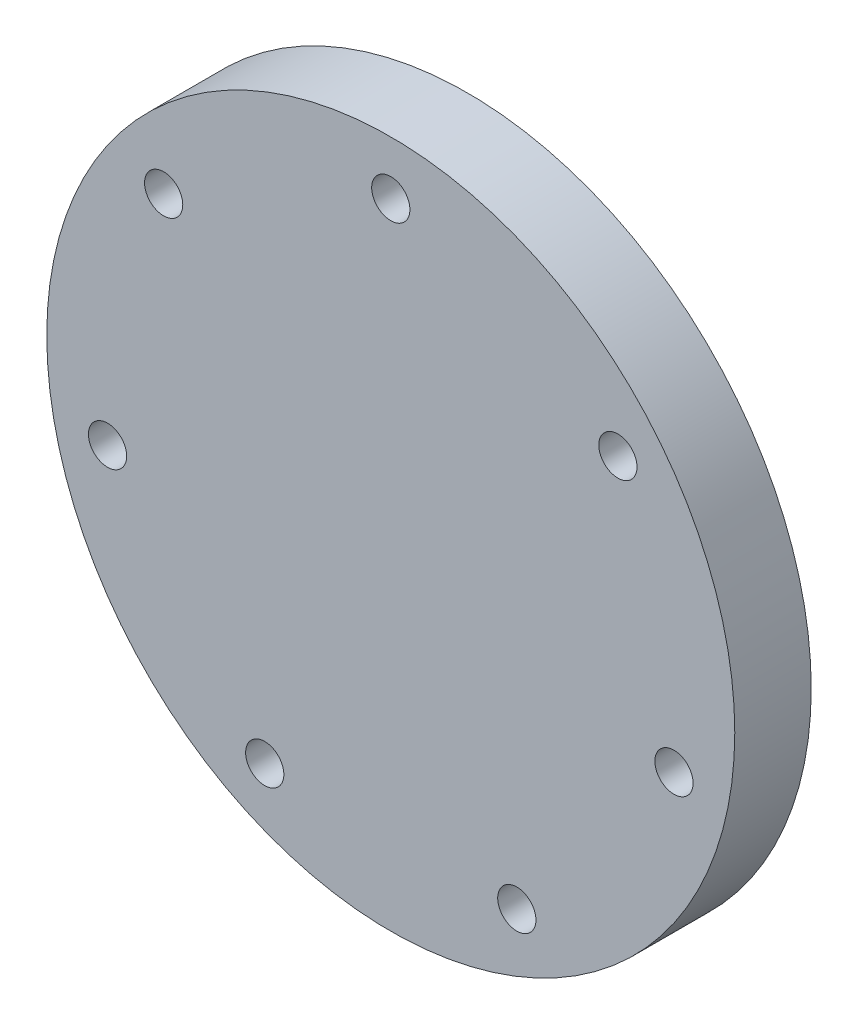
ISO-10303-21;
HEADER;
FILE_DESCRIPTION(('STEP AP214'),'2;1');
FILE_NAME('part.step','',(''),(''),'','','');
FILE_SCHEMA(('AUTOMOTIVE_DESIGN { 1 0 10303 214 1 1 1 1 }'));
ENDSEC;
DATA;
#1=APPLICATION_CONTEXT('core data for automotive mechanical design processes');
#2=APPLICATION_PROTOCOL_DEFINITION('international standard','automotive_design',2000,#1);
#3=PRODUCT_CONTEXT('',#1,'mechanical');
#4=PRODUCT('Part','Part','',(#3));
#5=PRODUCT_RELATED_PRODUCT_CATEGORY('part','',(#4));
#6=PRODUCT_DEFINITION_FORMATION('','',#4);
#7=PRODUCT_DEFINITION_CONTEXT('part definition',#1,'design');
#8=PRODUCT_DEFINITION('design','',#6,#7);
#9=PRODUCT_DEFINITION_SHAPE('','',#8);
#10=(LENGTH_UNIT() NAMED_UNIT(*) SI_UNIT(.MILLI.,.METRE.));
#11=(NAMED_UNIT(*) PLANE_ANGLE_UNIT() SI_UNIT($,.RADIAN.));
#12=(NAMED_UNIT(*) SI_UNIT($,.STERADIAN.) SOLID_ANGLE_UNIT());
#13=UNCERTAINTY_MEASURE_WITH_UNIT(LENGTH_MEASURE(1.E-05),#10,'distance_accuracy_value','');
#14=(GEOMETRIC_REPRESENTATION_CONTEXT(3) GLOBAL_UNCERTAINTY_ASSIGNED_CONTEXT((#13)) GLOBAL_UNIT_ASSIGNED_CONTEXT((#10,
#11,#12)) REPRESENTATION_CONTEXT('',''));
#15=CARTESIAN_POINT('',(0.,0.,0.));
#16=DIRECTION('',(0.,0.,1.));
#17=DIRECTION('',(1.,0.,0.));
#18=AXIS2_PLACEMENT_3D('',#15,#16,#17);
#19=CARTESIAN_POINT('',(0.,0.,5.));
#20=DIRECTION('',(0.,0.,1.));
#21=DIRECTION('',(1.,0.,0.));
#22=AXIS2_PLACEMENT_3D('',#19,#20,#21);
#23=PLANE('',#22);
#24=CARTESIAN_POINT('',(-8.24379104323223,-17.1184084901463,5.));
#25=DIRECTION('',(0.,0.,1.));
#26=DIRECTION('',(1.,0.,0.));
#27=AXIS2_PLACEMENT_3D('',#24,#25,#26);
#28=CIRCLE('',#27,1.25000000000021);
#29=CARTESIAN_POINT('',(-6.99379104323203,-17.1184084901463,5.));
#30=VERTEX_POINT('',#29);
#31=EDGE_CURVE('E71',#30,#30,#28,.T.);
#32=ORIENTED_EDGE('',*,*,#31,.F.);
#33=EDGE_LOOP('',(#32));
#34=FACE_BOUND('',#33,.T.);
#35=CARTESIAN_POINT('',(18.5236303314554,-4.22789774516939,5.));
#36=DIRECTION('',(0.,0.,1.));
#37=DIRECTION('',(1.,0.,0.));
#38=AXIS2_PLACEMENT_3D('',#35,#36,#37);
#39=CIRCLE('',#38,1.25);
#40=CARTESIAN_POINT('',(19.7736303314554,-4.22789774516939,5.));
#41=VERTEX_POINT('',#40);
#42=EDGE_CURVE('E59',#41,#41,#39,.T.);
#43=ORIENTED_EDGE('',*,*,#42,.F.);
#44=EDGE_LOOP('',(#43));
#45=FACE_BOUND('',#44,.T.);
#46=CARTESIAN_POINT('',(-14.8547981668923,11.8463062353154,5.));
#47=DIRECTION('',(0.,0.,1.));
#48=DIRECTION('',(1.,0.,0.));
#49=AXIS2_PLACEMENT_3D('',#46,#47,#48);
#50=CIRCLE('',#49,1.25000000000064);
#51=CARTESIAN_POINT('',(-13.6047981668917,11.8463062353154,5.));
#52=VERTEX_POINT('',#51);
#53=EDGE_CURVE('E47',#52,#52,#50,.T.);
#54=ORIENTED_EDGE('',*,*,#53,.F.);
#55=EDGE_LOOP('',(#54));
#56=FACE_BOUND('',#55,.T.);
#57=CARTESIAN_POINT('',(0.,0.,5.));
#58=DIRECTION('',(0.,0.,1.));
#59=DIRECTION('',(1.,0.,0.));
#60=AXIS2_PLACEMENT_3D('',#57,#58,#59);
#61=CIRCLE('',#60,22.5);
#62=CARTESIAN_POINT('',(22.5,0.,5.));
#63=VERTEX_POINT('',#62);
#64=EDGE_CURVE('E10',#63,#63,#61,.T.);
#65=ORIENTED_EDGE('',*,*,#64,.T.);
#66=EDGE_LOOP('',(#65));
#67=FACE_BOUND('',#66,.T.);
#68=CARTESIAN_POINT('',(0.,19.,5.));
#69=DIRECTION('',(0.,0.,1.));
#70=DIRECTION('',(1.,0.,0.));
#71=AXIS2_PLACEMENT_3D('',#68,#69,#70);
#72=CIRCLE('',#71,1.25);
#73=CARTESIAN_POINT('',(1.25,19.,5.));
#74=VERTEX_POINT('',#73);
#75=EDGE_CURVE('E42',#74,#74,#72,.T.);
#76=ORIENTED_EDGE('',*,*,#75,.F.);
#77=EDGE_LOOP('',(#76));
#78=FACE_BOUND('',#77,.T.);
#79=CARTESIAN_POINT('',(14.854798166893,11.8463062353164,5.));
#80=DIRECTION('',(0.,0.,1.));
#81=DIRECTION('',(1.,0.,0.));
#82=AXIS2_PLACEMENT_3D('',#79,#80,#81);
#83=CIRCLE('',#82,1.25);
#84=CARTESIAN_POINT('',(16.104798166893,11.8463062353164,5.));
#85=VERTEX_POINT('',#84);
#86=EDGE_CURVE('E53',#85,#85,#83,.T.);
#87=ORIENTED_EDGE('',*,*,#86,.F.);
#88=EDGE_LOOP('',(#87));
#89=FACE_BOUND('',#88,.T.);
#90=CARTESIAN_POINT('',(8.24379104323457,-17.1184084901455,5.));
#91=DIRECTION('',(0.,0.,1.));
#92=DIRECTION('',(1.,0.,0.));
#93=AXIS2_PLACEMENT_3D('',#90,#91,#92);
#94=CIRCLE('',#93,1.25);
#95=CARTESIAN_POINT('',(9.49379104323457,-17.1184084901455,5.));
#96=VERTEX_POINT('',#95);
#97=EDGE_CURVE('E65',#96,#96,#94,.T.);
#98=ORIENTED_EDGE('',*,*,#97,.F.);
#99=EDGE_LOOP('',(#98));
#100=FACE_BOUND('',#99,.T.);
#101=CARTESIAN_POINT('',(-18.5236303314538,-4.22789774517068,5.));
#102=DIRECTION('',(0.,0.,1.));
#103=DIRECTION('',(1.,0.,0.));
#104=AXIS2_PLACEMENT_3D('',#101,#102,#103);
#105=CIRCLE('',#104,1.25000000000046);
#106=CARTESIAN_POINT('',(-17.2736303314533,-4.22789774517068,5.));
#107=VERTEX_POINT('',#106);
#108=EDGE_CURVE('E77',#107,#107,#105,.T.);
#109=ORIENTED_EDGE('',*,*,#108,.F.);
#110=EDGE_LOOP('',(#109));
#111=FACE_BOUND('',#110,.T.);
#112=ADVANCED_FACE('F31',(#34,#45,#56,#67,#78,#89,#100,#111),#23,.T.);
#113=CARTESIAN_POINT('',(0.,0.,0.));
#114=DIRECTION('',(0.,0.,1.));
#115=DIRECTION('',(1.,0.,0.));
#116=AXIS2_PLACEMENT_3D('',#113,#114,#115);
#117=PLANE('',#116);
#118=CARTESIAN_POINT('',(0.,0.,0.));
#119=DIRECTION('',(0.,0.,1.));
#120=DIRECTION('',(1.,0.,0.));
#121=AXIS2_PLACEMENT_3D('',#118,#119,#120);
#122=CIRCLE('',#121,22.5);
#123=CARTESIAN_POINT('',(22.5,0.,0.));
#124=VERTEX_POINT('',#123);
#125=EDGE_CURVE('E35',#124,#124,#122,.T.);
#126=ORIENTED_EDGE('',*,*,#125,.F.);
#127=EDGE_LOOP('',(#126));
#128=FACE_BOUND('',#127,.T.);
#129=CARTESIAN_POINT('',(0.,19.,0.));
#130=DIRECTION('',(0.,0.,1.));
#131=DIRECTION('',(1.,0.,0.));
#132=AXIS2_PLACEMENT_3D('',#129,#130,#131);
#133=CIRCLE('',#132,1.25);
#134=CARTESIAN_POINT('',(1.25,19.,0.));
#135=VERTEX_POINT('',#134);
#136=EDGE_CURVE('E44',#135,#135,#133,.T.);
#137=ORIENTED_EDGE('',*,*,#136,.T.);
#138=EDGE_LOOP('',(#137));
#139=FACE_BOUND('',#138,.T.);
#140=CARTESIAN_POINT('',(-14.8547981668923,11.8463062353154,0.));
#141=DIRECTION('',(0.,0.,1.));
#142=DIRECTION('',(1.,0.,0.));
#143=AXIS2_PLACEMENT_3D('',#140,#141,#142);
#144=CIRCLE('',#143,1.25000000000064);
#145=CARTESIAN_POINT('',(-13.6047981668917,11.8463062353154,0.));
#146=VERTEX_POINT('',#145);
#147=EDGE_CURVE('E50',#146,#146,#144,.T.);
#148=ORIENTED_EDGE('',*,*,#147,.T.);
#149=EDGE_LOOP('',(#148));
#150=FACE_BOUND('',#149,.T.);
#151=CARTESIAN_POINT('',(14.854798166893,11.8463062353164,0.));
#152=DIRECTION('',(0.,0.,1.));
#153=DIRECTION('',(1.,0.,0.));
#154=AXIS2_PLACEMENT_3D('',#151,#152,#153);
#155=CIRCLE('',#154,1.25);
#156=CARTESIAN_POINT('',(16.104798166893,11.8463062353164,0.));
#157=VERTEX_POINT('',#156);
#158=EDGE_CURVE('E56',#157,#157,#155,.T.);
#159=ORIENTED_EDGE('',*,*,#158,.T.);
#160=EDGE_LOOP('',(#159));
#161=FACE_BOUND('',#160,.T.);
#162=CARTESIAN_POINT('',(18.5236303314554,-4.22789774516939,0.));
#163=DIRECTION('',(0.,0.,1.));
#164=DIRECTION('',(1.,0.,0.));
#165=AXIS2_PLACEMENT_3D('',#162,#163,#164);
#166=CIRCLE('',#165,1.25);
#167=CARTESIAN_POINT('',(19.7736303314554,-4.22789774516939,0.));
#168=VERTEX_POINT('',#167);
#169=EDGE_CURVE('E62',#168,#168,#166,.T.);
#170=ORIENTED_EDGE('',*,*,#169,.T.);
#171=EDGE_LOOP('',(#170));
#172=FACE_BOUND('',#171,.T.);
#173=CARTESIAN_POINT('',(8.24379104323457,-17.1184084901455,0.));
#174=DIRECTION('',(0.,0.,1.));
#175=DIRECTION('',(1.,0.,0.));
#176=AXIS2_PLACEMENT_3D('',#173,#174,#175);
#177=CIRCLE('',#176,1.25);
#178=CARTESIAN_POINT('',(9.49379104323457,-17.1184084901455,0.));
#179=VERTEX_POINT('',#178);
#180=EDGE_CURVE('E68',#179,#179,#177,.T.);
#181=ORIENTED_EDGE('',*,*,#180,.T.);
#182=EDGE_LOOP('',(#181));
#183=FACE_BOUND('',#182,.T.);
#184=CARTESIAN_POINT('',(-8.24379104323223,-17.1184084901463,0.));
#185=DIRECTION('',(0.,0.,1.));
#186=DIRECTION('',(1.,0.,0.));
#187=AXIS2_PLACEMENT_3D('',#184,#185,#186);
#188=CIRCLE('',#187,1.25000000000021);
#189=CARTESIAN_POINT('',(-6.99379104323203,-17.1184084901463,0.));
#190=VERTEX_POINT('',#189);
#191=EDGE_CURVE('E74',#190,#190,#188,.T.);
#192=ORIENTED_EDGE('',*,*,#191,.T.);
#193=EDGE_LOOP('',(#192));
#194=FACE_BOUND('',#193,.T.);
#195=CARTESIAN_POINT('',(-18.5236303314538,-4.22789774517068,0.));
#196=DIRECTION('',(0.,0.,1.));
#197=DIRECTION('',(1.,0.,0.));
#198=AXIS2_PLACEMENT_3D('',#195,#196,#197);
#199=CIRCLE('',#198,1.25000000000046);
#200=CARTESIAN_POINT('',(-17.2736303314533,-4.22789774517068,0.));
#201=VERTEX_POINT('',#200);
#202=EDGE_CURVE('E80',#201,#201,#199,.T.);
#203=ORIENTED_EDGE('',*,*,#202,.T.);
#204=EDGE_LOOP('',(#203));
#205=FACE_BOUND('',#204,.T.);
#206=ADVANCED_FACE('F90',(#128,#139,#150,#161,#172,#183,#194,#205),#117,.F.);
#207=CARTESIAN_POINT('',(0.,0.,5.));
#208=DIRECTION('',(0.,0.,-1.));
#209=DIRECTION('',(-1.,0.,0.));
#210=AXIS2_PLACEMENT_3D('',#207,#208,#209);
#211=CYLINDRICAL_SURFACE('',#210,22.5);
#212=ORIENTED_EDGE('',*,*,#64,.F.);
#213=EDGE_LOOP('',(#212));
#214=FACE_BOUND('',#213,.T.);
#215=ORIENTED_EDGE('',*,*,#125,.T.);
#216=EDGE_LOOP('',(#215));
#217=FACE_BOUND('',#216,.T.);
#218=ADVANCED_FACE('F33',(#214,#217),#211,.T.);
#219=CARTESIAN_POINT('',(0.,19.,5.));
#220=DIRECTION('',(0.,0.,-1.));
#221=DIRECTION('',(-1.,0.,0.));
#222=AXIS2_PLACEMENT_3D('',#219,#220,#221);
#223=CYLINDRICAL_SURFACE('',#222,1.25);
#224=ORIENTED_EDGE('',*,*,#75,.T.);
#225=EDGE_LOOP('',(#224));
#226=FACE_BOUND('',#225,.T.);
#227=ORIENTED_EDGE('',*,*,#136,.F.);
#228=EDGE_LOOP('',(#227));
#229=FACE_BOUND('',#228,.T.);
#230=ADVANCED_FACE('F100',(#226,#229),#223,.F.);
#231=CARTESIAN_POINT('',(-14.8547981668923,11.8463062353154,5.));
#232=DIRECTION('',(0.,0.,-1.));
#233=DIRECTION('',(-1.,0.,0.));
#234=AXIS2_PLACEMENT_3D('',#231,#232,#233);
#235=CYLINDRICAL_SURFACE('',#234,1.25000000000064);
#236=ORIENTED_EDGE('',*,*,#53,.T.);
#237=EDGE_LOOP('',(#236));
#238=FACE_BOUND('',#237,.T.);
#239=ORIENTED_EDGE('',*,*,#147,.F.);
#240=EDGE_LOOP('',(#239));
#241=FACE_BOUND('',#240,.T.);
#242=ADVANCED_FACE('F103',(#238,#241),#235,.F.);
#243=CARTESIAN_POINT('',(14.854798166893,11.8463062353164,5.));
#244=DIRECTION('',(0.,0.,-1.));
#245=DIRECTION('',(-1.,0.,0.));
#246=AXIS2_PLACEMENT_3D('',#243,#244,#245);
#247=CYLINDRICAL_SURFACE('',#246,1.25);
#248=ORIENTED_EDGE('',*,*,#86,.T.);
#249=EDGE_LOOP('',(#248));
#250=FACE_BOUND('',#249,.T.);
#251=ORIENTED_EDGE('',*,*,#158,.F.);
#252=EDGE_LOOP('',(#251));
#253=FACE_BOUND('',#252,.T.);
#254=ADVANCED_FACE('F107',(#250,#253),#247,.F.);
#255=CARTESIAN_POINT('',(18.5236303314554,-4.22789774516939,5.));
#256=DIRECTION('',(0.,0.,-1.));
#257=DIRECTION('',(-1.,0.,0.));
#258=AXIS2_PLACEMENT_3D('',#255,#256,#257);
#259=CYLINDRICAL_SURFACE('',#258,1.25);
#260=ORIENTED_EDGE('',*,*,#42,.T.);
#261=EDGE_LOOP('',(#260));
#262=FACE_BOUND('',#261,.T.);
#263=ORIENTED_EDGE('',*,*,#169,.F.);
#264=EDGE_LOOP('',(#263));
#265=FACE_BOUND('',#264,.T.);
#266=ADVANCED_FACE('F111',(#262,#265),#259,.F.);
#267=CARTESIAN_POINT('',(8.24379104323457,-17.1184084901455,5.));
#268=DIRECTION('',(0.,0.,-1.));
#269=DIRECTION('',(-1.,0.,0.));
#270=AXIS2_PLACEMENT_3D('',#267,#268,#269);
#271=CYLINDRICAL_SURFACE('',#270,1.25);
#272=ORIENTED_EDGE('',*,*,#97,.T.);
#273=EDGE_LOOP('',(#272));
#274=FACE_BOUND('',#273,.T.);
#275=ORIENTED_EDGE('',*,*,#180,.F.);
#276=EDGE_LOOP('',(#275));
#277=FACE_BOUND('',#276,.T.);
#278=ADVANCED_FACE('F115',(#274,#277),#271,.F.);
#279=CARTESIAN_POINT('',(-8.24379104323223,-17.1184084901463,5.));
#280=DIRECTION('',(0.,0.,-1.));
#281=DIRECTION('',(-1.,0.,0.));
#282=AXIS2_PLACEMENT_3D('',#279,#280,#281);
#283=CYLINDRICAL_SURFACE('',#282,1.25000000000021);
#284=ORIENTED_EDGE('',*,*,#31,.T.);
#285=EDGE_LOOP('',(#284));
#286=FACE_BOUND('',#285,.T.);
#287=ORIENTED_EDGE('',*,*,#191,.F.);
#288=EDGE_LOOP('',(#287));
#289=FACE_BOUND('',#288,.T.);
#290=ADVANCED_FACE('F119',(#286,#289),#283,.F.);
#291=CARTESIAN_POINT('',(-18.5236303314538,-4.22789774517068,5.));
#292=DIRECTION('',(0.,0.,-1.));
#293=DIRECTION('',(-1.,0.,0.));
#294=AXIS2_PLACEMENT_3D('',#291,#292,#293);
#295=CYLINDRICAL_SURFACE('',#294,1.25000000000046);
#296=ORIENTED_EDGE('',*,*,#108,.T.);
#297=EDGE_LOOP('',(#296));
#298=FACE_BOUND('',#297,.T.);
#299=ORIENTED_EDGE('',*,*,#202,.F.);
#300=EDGE_LOOP('',(#299));
#301=FACE_BOUND('',#300,.T.);
#302=ADVANCED_FACE('F86',(#298,#301),#295,.F.);
#303=CLOSED_SHELL('',(#112,#206,#218,#230,#242,#254,#266,#278,#290,#302));
#304=MANIFOLD_SOLID_BREP('B2',#303);
#305=ADVANCED_BREP_SHAPE_REPRESENTATION('',(#18,#304),#14);
#306=SHAPE_DEFINITION_REPRESENTATION(#9,#305);
ENDSEC;
END-ISO-10303-21;
